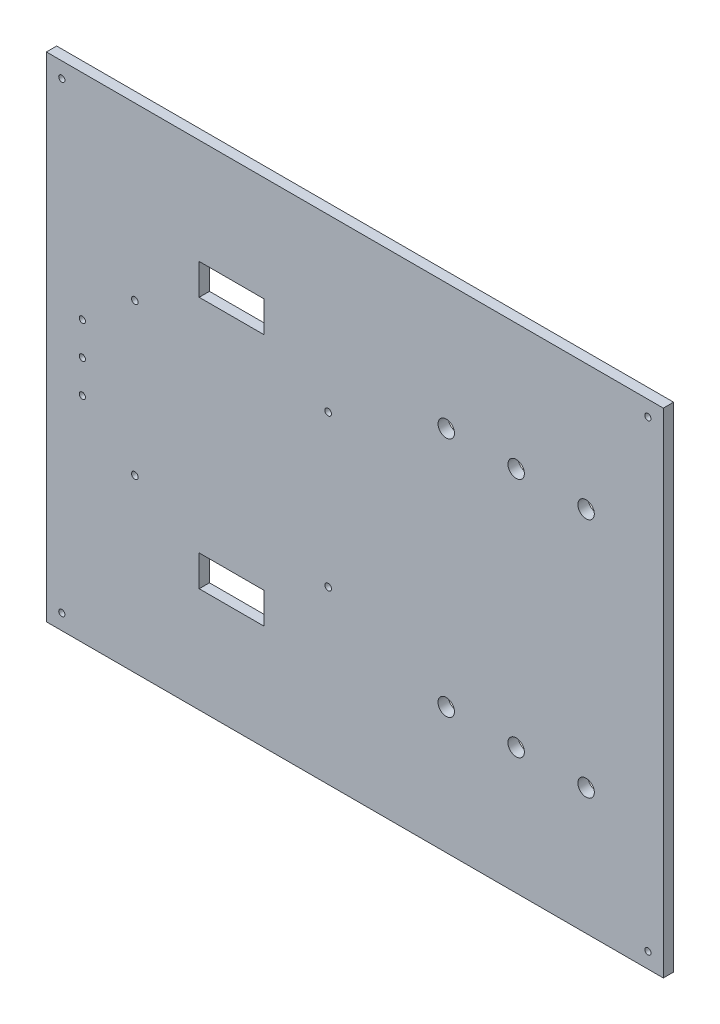
ISO-10303-21;
HEADER;
FILE_DESCRIPTION(('STEP AP214'),'2;1');
FILE_NAME('part.step','',(''),(''),'','','');
FILE_SCHEMA(('AUTOMOTIVE_DESIGN { 1 0 10303 214 1 1 1 1 }'));
ENDSEC;
DATA;
#1=APPLICATION_CONTEXT('core data for automotive mechanical design processes');
#2=APPLICATION_PROTOCOL_DEFINITION('international standard','automotive_design',2000,#1);
#3=PRODUCT_CONTEXT('',#1,'mechanical');
#4=PRODUCT('Part','Part','',(#3));
#5=PRODUCT_RELATED_PRODUCT_CATEGORY('part','',(#4));
#6=PRODUCT_DEFINITION_FORMATION('','',#4);
#7=PRODUCT_DEFINITION_CONTEXT('part definition',#1,'design');
#8=PRODUCT_DEFINITION('design','',#6,#7);
#9=PRODUCT_DEFINITION_SHAPE('','',#8);
#10=(LENGTH_UNIT() NAMED_UNIT(*) SI_UNIT(.MILLI.,.METRE.));
#11=(NAMED_UNIT(*) PLANE_ANGLE_UNIT() SI_UNIT($,.RADIAN.));
#12=(NAMED_UNIT(*) SI_UNIT($,.STERADIAN.) SOLID_ANGLE_UNIT());
#13=UNCERTAINTY_MEASURE_WITH_UNIT(LENGTH_MEASURE(1.E-05),#10,'distance_accuracy_value','');
#14=(GEOMETRIC_REPRESENTATION_CONTEXT(3) GLOBAL_UNCERTAINTY_ASSIGNED_CONTEXT((#13)) GLOBAL_UNIT_ASSIGNED_CONTEXT((#10,
#11,#12)) REPRESENTATION_CONTEXT('',''));
#15=CARTESIAN_POINT('',(0.,0.,0.));
#16=DIRECTION('',(0.,0.,1.));
#17=DIRECTION('',(1.,0.,0.));
#18=AXIS2_PLACEMENT_3D('',#15,#16,#17);
#19=CARTESIAN_POINT('',(0.,0.,5.));
#20=DIRECTION('',(0.,0.,-1.));
#21=DIRECTION('',(-1.,0.,0.));
#22=AXIS2_PLACEMENT_3D('',#19,#20,#21);
#23=PLANE('',#22);
#24=CARTESIAN_POINT('',(194.44243222447,61.3750001370397,5.));
#25=DIRECTION('',(0.,0.,1.));
#26=DIRECTION('',(1.,0.,0.));
#27=AXIS2_PLACEMENT_3D('',#24,#25,#26);
#28=CIRCLE('',#27,3.99999999999999);
#29=CARTESIAN_POINT('',(198.44243222447,61.3750001370397,5.));
#30=VERTEX_POINT('',#29);
#31=EDGE_CURVE('E406',#30,#30,#28,.T.);
#32=ORIENTED_EDGE('',*,*,#31,.F.);
#33=EDGE_LOOP('',(#32));
#34=FACE_BOUND('',#33,.T.);
#35=CARTESIAN_POINT('',(228.44243222447,61.3750001370398,5.));
#36=DIRECTION('',(0.,0.,1.));
#37=DIRECTION('',(1.,0.,0.));
#38=AXIS2_PLACEMENT_3D('',#35,#36,#37);
#39=CIRCLE('',#38,3.99999999999999);
#40=CARTESIAN_POINT('',(232.44243222447,61.3750001370398,5.));
#41=VERTEX_POINT('',#40);
#42=EDGE_CURVE('E407',#41,#41,#39,.T.);
#43=ORIENTED_EDGE('',*,*,#42,.F.);
#44=EDGE_LOOP('',(#43));
#45=FACE_BOUND('',#44,.T.);
#46=CARTESIAN_POINT('',(262.44243222447,61.3750001370398,5.));
#47=DIRECTION('',(0.,0.,1.));
#48=DIRECTION('',(1.,0.,0.));
#49=AXIS2_PLACEMENT_3D('',#46,#47,#48);
#50=CIRCLE('',#49,3.99999999999999);
#51=CARTESIAN_POINT('',(266.44243222447,61.3750001370398,5.));
#52=VERTEX_POINT('',#51);
#53=EDGE_CURVE('E417',#52,#52,#50,.T.);
#54=ORIENTED_EDGE('',*,*,#53,.F.);
#55=EDGE_LOOP('',(#54));
#56=FACE_BOUND('',#55,.T.);
#57=CARTESIAN_POINT('',(194.44243222447,178.62500013704,5.));
#58=DIRECTION('',(0.,0.,1.));
#59=DIRECTION('',(1.,0.,0.));
#60=AXIS2_PLACEMENT_3D('',#57,#58,#59);
#61=CIRCLE('',#60,3.99999999999999);
#62=CARTESIAN_POINT('',(198.44243222447,178.62500013704,5.));
#63=VERTEX_POINT('',#62);
#64=EDGE_CURVE('E427',#63,#63,#61,.T.);
#65=ORIENTED_EDGE('',*,*,#64,.F.);
#66=EDGE_LOOP('',(#65));
#67=FACE_BOUND('',#66,.T.);
#68=CARTESIAN_POINT('',(228.44243222447,178.62500013704,5.));
#69=DIRECTION('',(0.,0.,1.));
#70=DIRECTION('',(1.,0.,0.));
#71=AXIS2_PLACEMENT_3D('',#68,#69,#70);
#72=CIRCLE('',#71,3.99999999999999);
#73=CARTESIAN_POINT('',(232.44243222447,178.62500013704,5.));
#74=VERTEX_POINT('',#73);
#75=EDGE_CURVE('E430',#74,#74,#72,.T.);
#76=ORIENTED_EDGE('',*,*,#75,.F.);
#77=EDGE_LOOP('',(#76));
#78=FACE_BOUND('',#77,.T.);
#79=CARTESIAN_POINT('',(262.44243222447,178.62500013704,5.));
#80=DIRECTION('',(0.,0.,1.));
#81=DIRECTION('',(1.,0.,0.));
#82=AXIS2_PLACEMENT_3D('',#79,#80,#81);
#83=CIRCLE('',#82,3.99999999999999);
#84=CARTESIAN_POINT('',(266.44243222447,178.62500013704,5.));
#85=VERTEX_POINT('',#84);
#86=EDGE_CURVE('E436',#85,#85,#83,.T.);
#87=ORIENTED_EDGE('',*,*,#86,.F.);
#88=EDGE_LOOP('',(#87));
#89=FACE_BOUND('',#88,.T.);
#90=CARTESIAN_POINT('',(17.4847964856888,136.,5.));
#91=DIRECTION('',(0.,0.,-1.));
#92=DIRECTION('',(-1.,0.,0.));
#93=AXIS2_PLACEMENT_3D('',#90,#91,#92);
#94=CIRCLE('',#93,1.5);
#95=CARTESIAN_POINT('',(15.9847964856888,136.,5.));
#96=VERTEX_POINT('',#95);
#97=EDGE_CURVE('E445',#96,#96,#94,.T.);
#98=ORIENTED_EDGE('',*,*,#97,.T.);
#99=EDGE_LOOP('',(#98));
#100=FACE_BOUND('',#99,.T.);
#101=CARTESIAN_POINT('',(17.4847964856888,120.,5.));
#102=DIRECTION('',(0.,0.,-1.));
#103=DIRECTION('',(-1.,0.,0.));
#104=AXIS2_PLACEMENT_3D('',#101,#102,#103);
#105=CIRCLE('',#104,1.5);
#106=CARTESIAN_POINT('',(15.9847964856888,120.,5.));
#107=VERTEX_POINT('',#106);
#108=EDGE_CURVE('E448',#107,#107,#105,.T.);
#109=ORIENTED_EDGE('',*,*,#108,.T.);
#110=EDGE_LOOP('',(#109));
#111=FACE_BOUND('',#110,.T.);
#112=CARTESIAN_POINT('',(17.4847964856888,104.,5.));
#113=DIRECTION('',(0.,0.,-1.));
#114=DIRECTION('',(-1.,0.,0.));
#115=AXIS2_PLACEMENT_3D('',#112,#113,#114);
#116=CIRCLE('',#115,1.5);
#117=CARTESIAN_POINT('',(15.9847964856888,104.,5.));
#118=VERTEX_POINT('',#117);
#119=EDGE_CURVE('E454',#118,#118,#116,.T.);
#120=ORIENTED_EDGE('',*,*,#119,.T.);
#121=EDGE_LOOP('',(#120));
#122=FACE_BOUND('',#121,.T.);
#123=CARTESIAN_POINT('',(7.49999999999996,232.5,5.));
#124=DIRECTION('',(0.,0.,1.));
#125=DIRECTION('',(1.,0.,0.));
#126=AXIS2_PLACEMENT_3D('',#123,#124,#125);
#127=CIRCLE('',#126,1.5);
#128=CARTESIAN_POINT('',(8.99999999999996,232.5,5.));
#129=VERTEX_POINT('',#128);
#130=EDGE_CURVE('E170',#129,#129,#127,.T.);
#131=ORIENTED_EDGE('',*,*,#130,.F.);
#132=EDGE_LOOP('',(#131));
#133=FACE_BOUND('',#132,.T.);
#134=CARTESIAN_POINT('',(137.,83.17,5.));
#135=DIRECTION('',(0.,0.,1.));
#136=DIRECTION('',(1.,0.,0.));
#137=AXIS2_PLACEMENT_3D('',#134,#135,#136);
#138=CIRCLE('',#137,1.59999999999999);
#139=CARTESIAN_POINT('',(138.6,83.17,5.));
#140=VERTEX_POINT('',#139);
#141=EDGE_CURVE('E176',#140,#140,#138,.T.);
#142=ORIENTED_EDGE('',*,*,#141,.F.);
#143=EDGE_LOOP('',(#142));
#144=FACE_BOUND('',#143,.T.);
#145=CARTESIAN_POINT('',(43.,83.17,5.));
#146=DIRECTION('',(0.,0.,1.));
#147=DIRECTION('',(-1.,0.,0.));
#148=AXIS2_PLACEMENT_3D('',#145,#146,#147);
#149=CIRCLE('',#148,1.6);
#150=CARTESIAN_POINT('',(41.4,83.17,5.));
#151=VERTEX_POINT('',#150);
#152=EDGE_CURVE('E182',#151,#151,#149,.T.);
#153=ORIENTED_EDGE('',*,*,#152,.F.);
#154=EDGE_LOOP('',(#153));
#155=FACE_BOUND('',#154,.T.);
#156=CARTESIAN_POINT('',(43.,156.83,5.));
#157=DIRECTION('',(0.,0.,1.));
#158=DIRECTION('',(1.,0.,0.));
#159=AXIS2_PLACEMENT_3D('',#156,#157,#158);
#160=CIRCLE('',#159,1.6);
#161=CARTESIAN_POINT('',(44.6,156.83,5.));
#162=VERTEX_POINT('',#161);
#163=EDGE_CURVE('E188',#162,#162,#160,.T.);
#164=ORIENTED_EDGE('',*,*,#163,.F.);
#165=EDGE_LOOP('',(#164));
#166=FACE_BOUND('',#165,.T.);
#167=DIRECTION('',(1.,0.,0.));
#168=VECTOR('',#167,1.);
#169=CARTESIAN_POINT('',(105.7,173.83,5.));
#170=LINE('',#169,#168);
#171=CARTESIAN_POINT('',(74.3,173.83,5.));
#172=VERTEX_POINT('',#171);
#173=CARTESIAN_POINT('',(105.7,173.83,5.));
#174=VERTEX_POINT('',#173);
#175=EDGE_CURVE('E194',#172,#174,#170,.T.);
#176=ORIENTED_EDGE('',*,*,#175,.F.);
#177=DIRECTION('',(0.,-1.,0.));
#178=VECTOR('',#177,1.);
#179=CARTESIAN_POINT('',(74.3,173.83,5.));
#180=LINE('',#179,#178);
#181=CARTESIAN_POINT('',(74.3,188.92,5.));
#182=VERTEX_POINT('',#181);
#183=EDGE_CURVE('E202',#182,#172,#180,.T.);
#184=ORIENTED_EDGE('',*,*,#183,.F.);
#185=DIRECTION('',(-1.,0.,0.));
#186=VECTOR('',#185,1.);
#187=CARTESIAN_POINT('',(105.7,188.92,5.));
#188=LINE('',#187,#186);
#189=CARTESIAN_POINT('',(105.7,188.92,5.));
#190=VERTEX_POINT('',#189);
#191=EDGE_CURVE('E199',#190,#182,#188,.T.);
#192=ORIENTED_EDGE('',*,*,#191,.F.);
#193=DIRECTION('',(0.,1.,0.));
#194=VECTOR('',#193,1.);
#195=CARTESIAN_POINT('',(105.7,173.83,5.));
#196=LINE('',#195,#194);
#197=EDGE_CURVE('E196',#174,#190,#196,.T.);
#198=ORIENTED_EDGE('',*,*,#197,.F.);
#199=EDGE_LOOP('',(#176,#184,#192,#198));
#200=FACE_BOUND('',#199,.T.);
#201=DIRECTION('',(0.,-1.,0.));
#202=VECTOR('',#201,1.);
#203=CARTESIAN_POINT('',(0.,0.,5.));
#204=LINE('',#203,#202);
#205=CARTESIAN_POINT('',(0.,240.,5.));
#206=VERTEX_POINT('',#205);
#207=CARTESIAN_POINT('',(0.,0.,5.));
#208=VERTEX_POINT('',#207);
#209=EDGE_CURVE('E231',#206,#208,#204,.T.);
#210=ORIENTED_EDGE('',*,*,#209,.T.);
#211=DIRECTION('',(1.,0.,0.));
#212=VECTOR('',#211,1.);
#213=CARTESIAN_POINT('',(0.,0.,5.));
#214=LINE('',#213,#212);
#215=CARTESIAN_POINT('',(300.,0.,5.));
#216=VERTEX_POINT('',#215);
#217=EDGE_CURVE('E234',#208,#216,#214,.T.);
#218=ORIENTED_EDGE('',*,*,#217,.T.);
#219=DIRECTION('',(0.,1.,0.));
#220=VECTOR('',#219,1.);
#221=CARTESIAN_POINT('',(300.,0.,5.));
#222=LINE('',#221,#220);
#223=CARTESIAN_POINT('',(300.,240.,5.));
#224=VERTEX_POINT('',#223);
#225=EDGE_CURVE('E237',#216,#224,#222,.T.);
#226=ORIENTED_EDGE('',*,*,#225,.T.);
#227=DIRECTION('',(-1.,0.,0.));
#228=VECTOR('',#227,1.);
#229=CARTESIAN_POINT('',(0.,240.,5.));
#230=LINE('',#229,#228);
#231=EDGE_CURVE('E239',#224,#206,#230,.T.);
#232=ORIENTED_EDGE('',*,*,#231,.T.);
#233=EDGE_LOOP('',(#210,#218,#226,#232));
#234=FACE_BOUND('',#233,.T.);
#235=CARTESIAN_POINT('',(137.,156.83,5.));
#236=DIRECTION('',(0.,0.,1.));
#237=DIRECTION('',(-1.,0.,0.));
#238=AXIS2_PLACEMENT_3D('',#235,#236,#237);
#239=CIRCLE('',#238,1.59999999999999);
#240=CARTESIAN_POINT('',(135.4,156.83,5.));
#241=VERTEX_POINT('',#240);
#242=EDGE_CURVE('E225',#241,#241,#239,.T.);
#243=ORIENTED_EDGE('',*,*,#242,.F.);
#244=EDGE_LOOP('',(#243));
#245=FACE_BOUND('',#244,.T.);
#246=DIRECTION('',(0.,1.,0.));
#247=VECTOR('',#246,1.);
#248=CARTESIAN_POINT('',(105.7,66.17,5.));
#249=LINE('',#248,#247);
#250=CARTESIAN_POINT('',(105.7,51.08,5.));
#251=VERTEX_POINT('',#250);
#252=CARTESIAN_POINT('',(105.7,66.17,5.));
#253=VERTEX_POINT('',#252);
#254=EDGE_CURVE('E131',#251,#253,#249,.T.);
#255=ORIENTED_EDGE('',*,*,#254,.F.);
#256=DIRECTION('',(1.,0.,0.));
#257=VECTOR('',#256,1.);
#258=CARTESIAN_POINT('',(105.7,51.08,5.));
#259=LINE('',#258,#257);
#260=CARTESIAN_POINT('',(74.3,51.08,5.));
#261=VERTEX_POINT('',#260);
#262=EDGE_CURVE('E154',#261,#251,#259,.T.);
#263=ORIENTED_EDGE('',*,*,#262,.F.);
#264=DIRECTION('',(0.,-1.,0.));
#265=VECTOR('',#264,1.);
#266=CARTESIAN_POINT('',(74.3,66.17,5.));
#267=LINE('',#266,#265);
#268=CARTESIAN_POINT('',(74.3,66.17,5.));
#269=VERTEX_POINT('',#268);
#270=EDGE_CURVE('E152',#269,#261,#267,.T.);
#271=ORIENTED_EDGE('',*,*,#270,.F.);
#272=DIRECTION('',(-1.,0.,0.));
#273=VECTOR('',#272,1.);
#274=CARTESIAN_POINT('',(105.7,66.17,5.));
#275=LINE('',#274,#273);
#276=EDGE_CURVE('E139',#253,#269,#275,.T.);
#277=ORIENTED_EDGE('',*,*,#276,.F.);
#278=EDGE_LOOP('',(#255,#263,#271,#277));
#279=FACE_BOUND('',#278,.T.);
#280=CARTESIAN_POINT('',(292.5,232.5,5.));
#281=DIRECTION('',(0.,0.,1.));
#282=DIRECTION('',(-1.,0.,0.));
#283=AXIS2_PLACEMENT_3D('',#280,#281,#282);
#284=CIRCLE('',#283,1.50000000000002);
#285=CARTESIAN_POINT('',(291.,232.5,5.));
#286=VERTEX_POINT('',#285);
#287=EDGE_CURVE('E160',#286,#286,#284,.T.);
#288=ORIENTED_EDGE('',*,*,#287,.F.);
#289=EDGE_LOOP('',(#288));
#290=FACE_BOUND('',#289,.T.);
#291=CARTESIAN_POINT('',(292.5,7.49999999999998,5.));
#292=DIRECTION('',(0.,0.,1.));
#293=DIRECTION('',(1.,0.,0.));
#294=AXIS2_PLACEMENT_3D('',#291,#292,#293);
#295=CIRCLE('',#294,1.50000000000002);
#296=CARTESIAN_POINT('',(294.,7.49999999999998,5.));
#297=VERTEX_POINT('',#296);
#298=EDGE_CURVE('E465',#297,#297,#295,.T.);
#299=ORIENTED_EDGE('',*,*,#298,.F.);
#300=EDGE_LOOP('',(#299));
#301=FACE_BOUND('',#300,.T.);
#302=CARTESIAN_POINT('',(7.49999999999996,7.49999999999998,5.));
#303=DIRECTION('',(0.,0.,1.));
#304=DIRECTION('',(-1.,0.,0.));
#305=AXIS2_PLACEMENT_3D('',#302,#303,#304);
#306=CIRCLE('',#305,1.5);
#307=CARTESIAN_POINT('',(5.99999999999996,7.49999999999998,5.));
#308=VERTEX_POINT('',#307);
#309=EDGE_CURVE('E459',#308,#308,#306,.T.);
#310=ORIENTED_EDGE('',*,*,#309,.F.);
#311=EDGE_LOOP('',(#310));
#312=FACE_BOUND('',#311,.T.);
#313=ADVANCED_FACE('F42',(#34,#45,#56,#67,#78,#89,#100,#111,#122,#133,#144,#155,#166,#200,#234,
#245,#279,#290,#301,#312),#23,.F.);
#314=CARTESIAN_POINT('',(0.,0.,0.));
#315=DIRECTION('',(0.,0.,-1.));
#316=DIRECTION('',(-1.,0.,0.));
#317=AXIS2_PLACEMENT_3D('',#314,#315,#316);
#318=PLANE('',#317);
#319=CARTESIAN_POINT('',(194.44243222447,61.3750001370397,0.));
#320=DIRECTION('',(0.,0.,1.));
#321=DIRECTION('',(1.,0.,0.));
#322=AXIS2_PLACEMENT_3D('',#319,#320,#321);
#323=CIRCLE('',#322,3.99999999999999);
#324=CARTESIAN_POINT('',(198.44243222447,61.3750001370397,0.));
#325=VERTEX_POINT('',#324);
#326=EDGE_CURVE('E404',#325,#325,#323,.T.);
#327=ORIENTED_EDGE('',*,*,#326,.T.);
#328=EDGE_LOOP('',(#327));
#329=FACE_BOUND('',#328,.T.);
#330=CARTESIAN_POINT('',(228.44243222447,61.3750001370398,0.));
#331=DIRECTION('',(0.,0.,1.));
#332=DIRECTION('',(1.,0.,0.));
#333=AXIS2_PLACEMENT_3D('',#330,#331,#332);
#334=CIRCLE('',#333,3.99999999999999);
#335=CARTESIAN_POINT('',(232.44243222447,61.3750001370398,0.));
#336=VERTEX_POINT('',#335);
#337=EDGE_CURVE('E412',#336,#336,#334,.T.);
#338=ORIENTED_EDGE('',*,*,#337,.T.);
#339=EDGE_LOOP('',(#338));
#340=FACE_BOUND('',#339,.T.);
#341=CARTESIAN_POINT('',(262.44243222447,61.3750001370398,0.));
#342=DIRECTION('',(0.,0.,1.));
#343=DIRECTION('',(1.,0.,0.));
#344=AXIS2_PLACEMENT_3D('',#341,#342,#343);
#345=CIRCLE('',#344,3.99999999999999);
#346=CARTESIAN_POINT('',(266.44243222447,61.3750001370398,0.));
#347=VERTEX_POINT('',#346);
#348=EDGE_CURVE('E420',#347,#347,#345,.T.);
#349=ORIENTED_EDGE('',*,*,#348,.T.);
#350=EDGE_LOOP('',(#349));
#351=FACE_BOUND('',#350,.T.);
#352=CARTESIAN_POINT('',(194.44243222447,178.62500013704,0.));
#353=DIRECTION('',(0.,0.,1.));
#354=DIRECTION('',(1.,0.,0.));
#355=AXIS2_PLACEMENT_3D('',#352,#353,#354);
#356=CIRCLE('',#355,3.99999999999999);
#357=CARTESIAN_POINT('',(198.44243222447,178.62500013704,0.));
#358=VERTEX_POINT('',#357);
#359=EDGE_CURVE('E423',#358,#358,#356,.T.);
#360=ORIENTED_EDGE('',*,*,#359,.T.);
#361=EDGE_LOOP('',(#360));
#362=FACE_BOUND('',#361,.T.);
#363=CARTESIAN_POINT('',(228.44243222447,178.62500013704,0.));
#364=DIRECTION('',(0.,0.,1.));
#365=DIRECTION('',(1.,0.,0.));
#366=AXIS2_PLACEMENT_3D('',#363,#364,#365);
#367=CIRCLE('',#366,3.99999999999999);
#368=CARTESIAN_POINT('',(232.44243222447,178.62500013704,0.));
#369=VERTEX_POINT('',#368);
#370=EDGE_CURVE('E433',#369,#369,#367,.T.);
#371=ORIENTED_EDGE('',*,*,#370,.T.);
#372=EDGE_LOOP('',(#371));
#373=FACE_BOUND('',#372,.T.);
#374=CARTESIAN_POINT('',(262.44243222447,178.62500013704,0.));
#375=DIRECTION('',(0.,0.,1.));
#376=DIRECTION('',(1.,0.,0.));
#377=AXIS2_PLACEMENT_3D('',#374,#375,#376);
#378=CIRCLE('',#377,3.99999999999999);
#379=CARTESIAN_POINT('',(266.44243222447,178.62500013704,0.));
#380=VERTEX_POINT('',#379);
#381=EDGE_CURVE('E409',#380,#380,#378,.T.);
#382=ORIENTED_EDGE('',*,*,#381,.T.);
#383=EDGE_LOOP('',(#382));
#384=FACE_BOUND('',#383,.T.);
#385=CARTESIAN_POINT('',(17.4847964856888,136.,0.));
#386=DIRECTION('',(0.,0.,-1.));
#387=DIRECTION('',(-1.,0.,0.));
#388=AXIS2_PLACEMENT_3D('',#385,#386,#387);
#389=CIRCLE('',#388,1.5);
#390=CARTESIAN_POINT('',(15.9847964856888,136.,0.));
#391=VERTEX_POINT('',#390);
#392=EDGE_CURVE('E441',#391,#391,#389,.T.);
#393=ORIENTED_EDGE('',*,*,#392,.F.);
#394=EDGE_LOOP('',(#393));
#395=FACE_BOUND('',#394,.T.);
#396=CARTESIAN_POINT('',(17.4847964856888,120.,0.));
#397=DIRECTION('',(0.,0.,-1.));
#398=DIRECTION('',(-1.,0.,0.));
#399=AXIS2_PLACEMENT_3D('',#396,#397,#398);
#400=CIRCLE('',#399,1.5);
#401=CARTESIAN_POINT('',(15.9847964856888,120.,0.));
#402=VERTEX_POINT('',#401);
#403=EDGE_CURVE('E451',#402,#402,#400,.T.);
#404=ORIENTED_EDGE('',*,*,#403,.F.);
#405=EDGE_LOOP('',(#404));
#406=FACE_BOUND('',#405,.T.);
#407=CARTESIAN_POINT('',(17.4847964856888,104.,0.));
#408=DIRECTION('',(0.,0.,-1.));
#409=DIRECTION('',(-1.,0.,0.));
#410=AXIS2_PLACEMENT_3D('',#407,#408,#409);
#411=CIRCLE('',#410,1.5);
#412=CARTESIAN_POINT('',(15.9847964856888,104.,0.));
#413=VERTEX_POINT('',#412);
#414=EDGE_CURVE('E426',#413,#413,#411,.T.);
#415=ORIENTED_EDGE('',*,*,#414,.F.);
#416=EDGE_LOOP('',(#415));
#417=FACE_BOUND('',#416,.T.);
#418=CARTESIAN_POINT('',(292.5,7.49999999999998,0.));
#419=DIRECTION('',(0.,0.,1.));
#420=DIRECTION('',(1.,0.,0.));
#421=AXIS2_PLACEMENT_3D('',#418,#419,#420);
#422=CIRCLE('',#421,1.50000000000002);
#423=CARTESIAN_POINT('',(294.,7.49999999999998,0.));
#424=VERTEX_POINT('',#423);
#425=EDGE_CURVE('E462',#424,#424,#422,.T.);
#426=ORIENTED_EDGE('',*,*,#425,.T.);
#427=EDGE_LOOP('',(#426));
#428=FACE_BOUND('',#427,.T.);
#429=DIRECTION('',(1.,0.,0.));
#430=VECTOR('',#429,1.);
#431=CARTESIAN_POINT('',(105.7,51.08,0.));
#432=LINE('',#431,#430);
#433=CARTESIAN_POINT('',(74.3,51.08,0.));
#434=VERTEX_POINT('',#433);
#435=CARTESIAN_POINT('',(105.7,51.08,0.));
#436=VERTEX_POINT('',#435);
#437=EDGE_CURVE('E140',#434,#436,#432,.T.);
#438=ORIENTED_EDGE('',*,*,#437,.T.);
#439=DIRECTION('',(0.,1.,0.));
#440=VECTOR('',#439,1.);
#441=CARTESIAN_POINT('',(105.7,66.17,0.));
#442=LINE('',#441,#440);
#443=CARTESIAN_POINT('',(105.7,66.17,0.));
#444=VERTEX_POINT('',#443);
#445=EDGE_CURVE('E65',#436,#444,#442,.T.);
#446=ORIENTED_EDGE('',*,*,#445,.T.);
#447=DIRECTION('',(-1.,0.,0.));
#448=VECTOR('',#447,1.);
#449=CARTESIAN_POINT('',(105.7,66.17,0.));
#450=LINE('',#449,#448);
#451=CARTESIAN_POINT('',(74.3,66.17,0.));
#452=VERTEX_POINT('',#451);
#453=EDGE_CURVE('E146',#444,#452,#450,.T.);
#454=ORIENTED_EDGE('',*,*,#453,.T.);
#455=DIRECTION('',(0.,-1.,0.));
#456=VECTOR('',#455,1.);
#457=CARTESIAN_POINT('',(74.3,66.17,0.));
#458=LINE('',#457,#456);
#459=EDGE_CURVE('E162',#452,#434,#458,.T.);
#460=ORIENTED_EDGE('',*,*,#459,.T.);
#461=EDGE_LOOP('',(#438,#446,#454,#460));
#462=FACE_BOUND('',#461,.T.);
#463=CARTESIAN_POINT('',(7.49999999999996,232.5,0.));
#464=DIRECTION('',(0.,0.,1.));
#465=DIRECTION('',(1.,0.,0.));
#466=AXIS2_PLACEMENT_3D('',#463,#464,#465);
#467=CIRCLE('',#466,1.5);
#468=CARTESIAN_POINT('',(8.99999999999996,232.5,0.));
#469=VERTEX_POINT('',#468);
#470=EDGE_CURVE('E147',#469,#469,#467,.T.);
#471=ORIENTED_EDGE('',*,*,#470,.T.);
#472=EDGE_LOOP('',(#471));
#473=FACE_BOUND('',#472,.T.);
#474=CARTESIAN_POINT('',(43.,83.17,0.));
#475=DIRECTION('',(0.,0.,1.));
#476=DIRECTION('',(-1.,0.,0.));
#477=AXIS2_PLACEMENT_3D('',#474,#475,#476);
#478=CIRCLE('',#477,1.6);
#479=CARTESIAN_POINT('',(41.4,83.17,0.));
#480=VERTEX_POINT('',#479);
#481=EDGE_CURVE('E179',#480,#480,#478,.T.);
#482=ORIENTED_EDGE('',*,*,#481,.T.);
#483=EDGE_LOOP('',(#482));
#484=FACE_BOUND('',#483,.T.);
#485=DIRECTION('',(0.,-1.,0.));
#486=VECTOR('',#485,1.);
#487=CARTESIAN_POINT('',(74.3,173.83,0.));
#488=LINE('',#487,#486);
#489=CARTESIAN_POINT('',(74.3,188.92,0.));
#490=VERTEX_POINT('',#489);
#491=CARTESIAN_POINT('',(74.3,173.83,0.));
#492=VERTEX_POINT('',#491);
#493=EDGE_CURVE('E197',#490,#492,#488,.T.);
#494=ORIENTED_EDGE('',*,*,#493,.T.);
#495=DIRECTION('',(1.,0.,0.));
#496=VECTOR('',#495,1.);
#497=CARTESIAN_POINT('',(105.7,173.83,0.));
#498=LINE('',#497,#496);
#499=CARTESIAN_POINT('',(105.7,173.83,0.));
#500=VERTEX_POINT('',#499);
#501=EDGE_CURVE('E191',#492,#500,#498,.T.);
#502=ORIENTED_EDGE('',*,*,#501,.T.);
#503=DIRECTION('',(0.,1.,0.));
#504=VECTOR('',#503,1.);
#505=CARTESIAN_POINT('',(105.7,173.83,0.));
#506=LINE('',#505,#504);
#507=CARTESIAN_POINT('',(105.7,188.92,0.));
#508=VERTEX_POINT('',#507);
#509=EDGE_CURVE('E207',#500,#508,#506,.T.);
#510=ORIENTED_EDGE('',*,*,#509,.T.);
#511=DIRECTION('',(-1.,0.,0.));
#512=VECTOR('',#511,1.);
#513=CARTESIAN_POINT('',(105.7,188.92,0.));
#514=LINE('',#513,#512);
#515=EDGE_CURVE('E210',#508,#490,#514,.T.);
#516=ORIENTED_EDGE('',*,*,#515,.T.);
#517=EDGE_LOOP('',(#494,#502,#510,#516));
#518=FACE_BOUND('',#517,.T.);
#519=CARTESIAN_POINT('',(137.,156.83,0.));
#520=DIRECTION('',(0.,0.,1.));
#521=DIRECTION('',(-1.,0.,0.));
#522=AXIS2_PLACEMENT_3D('',#519,#520,#521);
#523=CIRCLE('',#522,1.59999999999999);
#524=CARTESIAN_POINT('',(135.4,156.83,0.));
#525=VERTEX_POINT('',#524);
#526=EDGE_CURVE('E224',#525,#525,#523,.T.);
#527=ORIENTED_EDGE('',*,*,#526,.T.);
#528=EDGE_LOOP('',(#527));
#529=FACE_BOUND('',#528,.T.);
#530=DIRECTION('',(0.,-1.,0.));
#531=VECTOR('',#530,1.);
#532=CARTESIAN_POINT('',(0.,0.,0.));
#533=LINE('',#532,#531);
#534=CARTESIAN_POINT('',(0.,240.,0.));
#535=VERTEX_POINT('',#534);
#536=CARTESIAN_POINT('',(0.,0.,0.));
#537=VERTEX_POINT('',#536);
#538=EDGE_CURVE('E228',#535,#537,#533,.T.);
#539=ORIENTED_EDGE('',*,*,#538,.F.);
#540=DIRECTION('',(-1.,0.,0.));
#541=VECTOR('',#540,1.);
#542=CARTESIAN_POINT('',(0.,240.,0.));
#543=LINE('',#542,#541);
#544=CARTESIAN_POINT('',(300.,240.,0.));
#545=VERTEX_POINT('',#544);
#546=EDGE_CURVE('E235',#545,#535,#543,.T.);
#547=ORIENTED_EDGE('',*,*,#546,.F.);
#548=DIRECTION('',(0.,1.,0.));
#549=VECTOR('',#548,1.);
#550=CARTESIAN_POINT('',(300.,0.,0.));
#551=LINE('',#550,#549);
#552=CARTESIAN_POINT('',(300.,0.,0.));
#553=VERTEX_POINT('',#552);
#554=EDGE_CURVE('E246',#553,#545,#551,.T.);
#555=ORIENTED_EDGE('',*,*,#554,.F.);
#556=DIRECTION('',(1.,0.,0.));
#557=VECTOR('',#556,1.);
#558=CARTESIAN_POINT('',(0.,0.,0.));
#559=LINE('',#558,#557);
#560=EDGE_CURVE('E244',#537,#553,#559,.T.);
#561=ORIENTED_EDGE('',*,*,#560,.F.);
#562=EDGE_LOOP('',(#539,#547,#555,#561));
#563=FACE_BOUND('',#562,.T.);
#564=CARTESIAN_POINT('',(43.,156.83,0.));
#565=DIRECTION('',(0.,0.,1.));
#566=DIRECTION('',(1.,0.,0.));
#567=AXIS2_PLACEMENT_3D('',#564,#565,#566);
#568=CIRCLE('',#567,1.6);
#569=CARTESIAN_POINT('',(44.6,156.83,0.));
#570=VERTEX_POINT('',#569);
#571=EDGE_CURVE('E185',#570,#570,#568,.T.);
#572=ORIENTED_EDGE('',*,*,#571,.T.);
#573=EDGE_LOOP('',(#572));
#574=FACE_BOUND('',#573,.T.);
#575=CARTESIAN_POINT('',(137.,83.17,0.));
#576=DIRECTION('',(0.,0.,1.));
#577=DIRECTION('',(1.,0.,0.));
#578=AXIS2_PLACEMENT_3D('',#575,#576,#577);
#579=CIRCLE('',#578,1.59999999999999);
#580=CARTESIAN_POINT('',(138.6,83.17,0.));
#581=VERTEX_POINT('',#580);
#582=EDGE_CURVE('E173',#581,#581,#579,.T.);
#583=ORIENTED_EDGE('',*,*,#582,.T.);
#584=EDGE_LOOP('',(#583));
#585=FACE_BOUND('',#584,.T.);
#586=CARTESIAN_POINT('',(292.5,232.5,0.));
#587=DIRECTION('',(0.,0.,1.));
#588=DIRECTION('',(-1.,0.,0.));
#589=AXIS2_PLACEMENT_3D('',#586,#587,#588);
#590=CIRCLE('',#589,1.50000000000002);
#591=CARTESIAN_POINT('',(291.,232.5,0.));
#592=VERTEX_POINT('',#591);
#593=EDGE_CURVE('E468',#592,#592,#590,.T.);
#594=ORIENTED_EDGE('',*,*,#593,.T.);
#595=EDGE_LOOP('',(#594));
#596=FACE_BOUND('',#595,.T.);
#597=CARTESIAN_POINT('',(7.49999999999996,7.49999999999998,0.));
#598=DIRECTION('',(0.,0.,1.));
#599=DIRECTION('',(-1.,0.,0.));
#600=AXIS2_PLACEMENT_3D('',#597,#598,#599);
#601=CIRCLE('',#600,1.5);
#602=CARTESIAN_POINT('',(5.99999999999996,7.49999999999998,0.));
#603=VERTEX_POINT('',#602);
#604=EDGE_CURVE('E444',#603,#603,#601,.T.);
#605=ORIENTED_EDGE('',*,*,#604,.T.);
#606=EDGE_LOOP('',(#605));
#607=FACE_BOUND('',#606,.T.);
#608=ADVANCED_FACE('F264',(#329,#340,#351,#362,#373,#384,#395,#406,#417,#428,#462,#473,#484,
#518,#529,#563,#574,#585,#596,#607),#318,.T.);
#609=CARTESIAN_POINT('',(0.,0.,5.));
#610=DIRECTION('',(1.,0.,0.));
#611=DIRECTION('',(0.,0.,-1.));
#612=AXIS2_PLACEMENT_3D('',#609,#610,#611);
#613=PLANE('',#612);
#614=ORIENTED_EDGE('',*,*,#538,.T.);
#615=DIRECTION('',(0.,0.,-1.));
#616=VECTOR('',#615,1.);
#617=CARTESIAN_POINT('',(0.,0.,5.));
#618=LINE('',#617,#616);
#619=EDGE_CURVE('E11',#208,#537,#618,.T.);
#620=ORIENTED_EDGE('',*,*,#619,.F.);
#621=ORIENTED_EDGE('',*,*,#209,.F.);
#622=DIRECTION('',(0.,0.,-1.));
#623=VECTOR('',#622,1.);
#624=CARTESIAN_POINT('',(0.,240.,5.));
#625=LINE('',#624,#623);
#626=EDGE_CURVE('E241',#206,#535,#625,.T.);
#627=ORIENTED_EDGE('',*,*,#626,.T.);
#628=EDGE_LOOP('',(#614,#620,#621,#627));
#629=FACE_BOUND('',#628,.T.);
#630=ADVANCED_FACE('F44',(#629),#613,.F.);
#631=CARTESIAN_POINT('',(0.,0.,5.));
#632=DIRECTION('',(0.,1.,0.));
#633=DIRECTION('',(0.,0.,1.));
#634=AXIS2_PLACEMENT_3D('',#631,#632,#633);
#635=PLANE('',#634);
#636=ORIENTED_EDGE('',*,*,#560,.T.);
#637=DIRECTION('',(0.,0.,-1.));
#638=VECTOR('',#637,1.);
#639=CARTESIAN_POINT('',(300.,0.,5.));
#640=LINE('',#639,#638);
#641=EDGE_CURVE('E50',#216,#553,#640,.T.);
#642=ORIENTED_EDGE('',*,*,#641,.F.);
#643=ORIENTED_EDGE('',*,*,#217,.F.);
#644=ORIENTED_EDGE('',*,*,#619,.T.);
#645=EDGE_LOOP('',(#636,#642,#643,#644));
#646=FACE_BOUND('',#645,.T.);
#647=ADVANCED_FACE('F275',(#646),#635,.F.);
#648=CARTESIAN_POINT('',(300.,0.,5.));
#649=DIRECTION('',(-1.,0.,0.));
#650=DIRECTION('',(0.,0.,1.));
#651=AXIS2_PLACEMENT_3D('',#648,#649,#650);
#652=PLANE('',#651);
#653=ORIENTED_EDGE('',*,*,#554,.T.);
#654=DIRECTION('',(0.,0.,-1.));
#655=VECTOR('',#654,1.);
#656=CARTESIAN_POINT('',(300.,240.,5.));
#657=LINE('',#656,#655);
#658=EDGE_CURVE('E251',#224,#545,#657,.T.);
#659=ORIENTED_EDGE('',*,*,#658,.F.);
#660=ORIENTED_EDGE('',*,*,#225,.F.);
#661=ORIENTED_EDGE('',*,*,#641,.T.);
#662=EDGE_LOOP('',(#653,#659,#660,#661));
#663=FACE_BOUND('',#662,.T.);
#664=ADVANCED_FACE('F258',(#663),#652,.F.);
#665=CARTESIAN_POINT('',(0.,240.,5.));
#666=DIRECTION('',(0.,-1.,0.));
#667=DIRECTION('',(0.,0.,-1.));
#668=AXIS2_PLACEMENT_3D('',#665,#666,#667);
#669=PLANE('',#668);
#670=ORIENTED_EDGE('',*,*,#546,.T.);
#671=ORIENTED_EDGE('',*,*,#626,.F.);
#672=ORIENTED_EDGE('',*,*,#231,.F.);
#673=ORIENTED_EDGE('',*,*,#658,.T.);
#674=EDGE_LOOP('',(#670,#671,#672,#673));
#675=FACE_BOUND('',#674,.T.);
#676=ADVANCED_FACE('F268',(#675),#669,.F.);
#677=CARTESIAN_POINT('',(137.,156.83,5.));
#678=DIRECTION('',(0.,0.,-1.));
#679=DIRECTION('',(-1.,0.,0.));
#680=AXIS2_PLACEMENT_3D('',#677,#678,#679);
#681=CYLINDRICAL_SURFACE('',#680,1.59999999999999);
#682=ORIENTED_EDGE('',*,*,#242,.T.);
#683=EDGE_LOOP('',(#682));
#684=FACE_BOUND('',#683,.T.);
#685=ORIENTED_EDGE('',*,*,#526,.F.);
#686=EDGE_LOOP('',(#685));
#687=FACE_BOUND('',#686,.T.);
#688=ADVANCED_FACE('F293',(#684,#687),#681,.F.);
#689=CARTESIAN_POINT('',(105.7,173.83,5.));
#690=DIRECTION('',(0.,1.,0.));
#691=DIRECTION('',(0.,0.,1.));
#692=AXIS2_PLACEMENT_3D('',#689,#690,#691);
#693=PLANE('',#692);
#694=ORIENTED_EDGE('',*,*,#501,.F.);
#695=DIRECTION('',(0.,0.,-1.));
#696=VECTOR('',#695,1.);
#697=CARTESIAN_POINT('',(74.3,173.83,5.));
#698=LINE('',#697,#696);
#699=EDGE_CURVE('E204',#172,#492,#698,.T.);
#700=ORIENTED_EDGE('',*,*,#699,.F.);
#701=ORIENTED_EDGE('',*,*,#175,.T.);
#702=DIRECTION('',(0.,0.,-1.));
#703=VECTOR('',#702,1.);
#704=CARTESIAN_POINT('',(105.7,173.83,5.));
#705=LINE('',#704,#703);
#706=EDGE_CURVE('E221',#174,#500,#705,.T.);
#707=ORIENTED_EDGE('',*,*,#706,.T.);
#708=EDGE_LOOP('',(#694,#700,#701,#707));
#709=FACE_BOUND('',#708,.T.);
#710=ADVANCED_FACE('F300',(#709),#693,.T.);
#711=CARTESIAN_POINT('',(105.7,173.83,5.));
#712=DIRECTION('',(-1.,0.,0.));
#713=DIRECTION('',(0.,0.,1.));
#714=AXIS2_PLACEMENT_3D('',#711,#712,#713);
#715=PLANE('',#714);
#716=ORIENTED_EDGE('',*,*,#509,.F.);
#717=ORIENTED_EDGE('',*,*,#706,.F.);
#718=ORIENTED_EDGE('',*,*,#197,.T.);
#719=DIRECTION('',(0.,0.,-1.));
#720=VECTOR('',#719,1.);
#721=CARTESIAN_POINT('',(105.7,188.92,5.));
#722=LINE('',#721,#720);
#723=EDGE_CURVE('E219',#190,#508,#722,.T.);
#724=ORIENTED_EDGE('',*,*,#723,.T.);
#725=EDGE_LOOP('',(#716,#717,#718,#724));
#726=FACE_BOUND('',#725,.T.);
#727=ADVANCED_FACE('F305',(#726),#715,.T.);
#728=CARTESIAN_POINT('',(105.7,188.92,5.));
#729=DIRECTION('',(0.,-1.,0.));
#730=DIRECTION('',(0.,0.,-1.));
#731=AXIS2_PLACEMENT_3D('',#728,#729,#730);
#732=PLANE('',#731);
#733=ORIENTED_EDGE('',*,*,#515,.F.);
#734=ORIENTED_EDGE('',*,*,#723,.F.);
#735=ORIENTED_EDGE('',*,*,#191,.T.);
#736=DIRECTION('',(0.,0.,-1.));
#737=VECTOR('',#736,1.);
#738=CARTESIAN_POINT('',(74.3,188.92,5.));
#739=LINE('',#738,#737);
#740=EDGE_CURVE('E217',#182,#490,#739,.T.);
#741=ORIENTED_EDGE('',*,*,#740,.T.);
#742=EDGE_LOOP('',(#733,#734,#735,#741));
#743=FACE_BOUND('',#742,.T.);
#744=ADVANCED_FACE('F314',(#743),#732,.T.);
#745=CARTESIAN_POINT('',(74.3,173.83,5.));
#746=DIRECTION('',(1.,0.,0.));
#747=DIRECTION('',(0.,0.,-1.));
#748=AXIS2_PLACEMENT_3D('',#745,#746,#747);
#749=PLANE('',#748);
#750=ORIENTED_EDGE('',*,*,#493,.F.);
#751=ORIENTED_EDGE('',*,*,#740,.F.);
#752=ORIENTED_EDGE('',*,*,#183,.T.);
#753=ORIENTED_EDGE('',*,*,#699,.T.);
#754=EDGE_LOOP('',(#750,#751,#752,#753));
#755=FACE_BOUND('',#754,.T.);
#756=ADVANCED_FACE('F320',(#755),#749,.T.);
#757=CARTESIAN_POINT('',(43.,156.83,5.));
#758=DIRECTION('',(0.,0.,-1.));
#759=DIRECTION('',(-1.,0.,0.));
#760=AXIS2_PLACEMENT_3D('',#757,#758,#759);
#761=CYLINDRICAL_SURFACE('',#760,1.6);
#762=ORIENTED_EDGE('',*,*,#163,.T.);
#763=EDGE_LOOP('',(#762));
#764=FACE_BOUND('',#763,.T.);
#765=ORIENTED_EDGE('',*,*,#571,.F.);
#766=EDGE_LOOP('',(#765));
#767=FACE_BOUND('',#766,.T.);
#768=ADVANCED_FACE('F324',(#764,#767),#761,.F.);
#769=CARTESIAN_POINT('',(43.,83.17,5.));
#770=DIRECTION('',(0.,0.,-1.));
#771=DIRECTION('',(-1.,0.,0.));
#772=AXIS2_PLACEMENT_3D('',#769,#770,#771);
#773=CYLINDRICAL_SURFACE('',#772,1.6);
#774=ORIENTED_EDGE('',*,*,#152,.T.);
#775=EDGE_LOOP('',(#774));
#776=FACE_BOUND('',#775,.T.);
#777=ORIENTED_EDGE('',*,*,#481,.F.);
#778=EDGE_LOOP('',(#777));
#779=FACE_BOUND('',#778,.T.);
#780=ADVANCED_FACE('F328',(#776,#779),#773,.F.);
#781=CARTESIAN_POINT('',(137.,83.17,5.));
#782=DIRECTION('',(0.,0.,-1.));
#783=DIRECTION('',(-1.,0.,0.));
#784=AXIS2_PLACEMENT_3D('',#781,#782,#783);
#785=CYLINDRICAL_SURFACE('',#784,1.59999999999999);
#786=ORIENTED_EDGE('',*,*,#141,.T.);
#787=EDGE_LOOP('',(#786));
#788=FACE_BOUND('',#787,.T.);
#789=ORIENTED_EDGE('',*,*,#582,.F.);
#790=EDGE_LOOP('',(#789));
#791=FACE_BOUND('',#790,.T.);
#792=ADVANCED_FACE('F332',(#788,#791),#785,.F.);
#793=CARTESIAN_POINT('',(7.49999999999996,232.5,5.));
#794=DIRECTION('',(0.,0.,-1.));
#795=DIRECTION('',(-1.,0.,0.));
#796=AXIS2_PLACEMENT_3D('',#793,#794,#795);
#797=CYLINDRICAL_SURFACE('',#796,1.5);
#798=ORIENTED_EDGE('',*,*,#130,.T.);
#799=EDGE_LOOP('',(#798));
#800=FACE_BOUND('',#799,.T.);
#801=ORIENTED_EDGE('',*,*,#470,.F.);
#802=EDGE_LOOP('',(#801));
#803=FACE_BOUND('',#802,.T.);
#804=ADVANCED_FACE('F336',(#800,#803),#797,.F.);
#805=CARTESIAN_POINT('',(105.7,66.17,5.));
#806=DIRECTION('',(-1.,0.,0.));
#807=DIRECTION('',(0.,0.,1.));
#808=AXIS2_PLACEMENT_3D('',#805,#806,#807);
#809=PLANE('',#808);
#810=ORIENTED_EDGE('',*,*,#445,.F.);
#811=DIRECTION('',(0.,0.,-1.));
#812=VECTOR('',#811,1.);
#813=CARTESIAN_POINT('',(105.7,51.08,5.));
#814=LINE('',#813,#812);
#815=EDGE_CURVE('E135',#251,#436,#814,.T.);
#816=ORIENTED_EDGE('',*,*,#815,.F.);
#817=ORIENTED_EDGE('',*,*,#254,.T.);
#818=DIRECTION('',(0.,0.,-1.));
#819=VECTOR('',#818,1.);
#820=CARTESIAN_POINT('',(105.7,66.17,5.));
#821=LINE('',#820,#819);
#822=EDGE_CURVE('E134',#253,#444,#821,.T.);
#823=ORIENTED_EDGE('',*,*,#822,.T.);
#824=EDGE_LOOP('',(#810,#816,#817,#823));
#825=FACE_BOUND('',#824,.T.);
#826=ADVANCED_FACE('F133',(#825),#809,.T.);
#827=CARTESIAN_POINT('',(105.7,66.17,5.));
#828=DIRECTION('',(0.,-1.,0.));
#829=DIRECTION('',(0.,0.,-1.));
#830=AXIS2_PLACEMENT_3D('',#827,#828,#829);
#831=PLANE('',#830);
#832=ORIENTED_EDGE('',*,*,#453,.F.);
#833=ORIENTED_EDGE('',*,*,#822,.F.);
#834=ORIENTED_EDGE('',*,*,#276,.T.);
#835=DIRECTION('',(0.,0.,-1.));
#836=VECTOR('',#835,1.);
#837=CARTESIAN_POINT('',(74.3,66.17,5.));
#838=LINE('',#837,#836);
#839=EDGE_CURVE('E148',#269,#452,#838,.T.);
#840=ORIENTED_EDGE('',*,*,#839,.T.);
#841=EDGE_LOOP('',(#832,#833,#834,#840));
#842=FACE_BOUND('',#841,.T.);
#843=ADVANCED_FACE('F143',(#842),#831,.T.);
#844=CARTESIAN_POINT('',(74.3,66.17,5.));
#845=DIRECTION('',(1.,0.,0.));
#846=DIRECTION('',(0.,0.,-1.));
#847=AXIS2_PLACEMENT_3D('',#844,#845,#846);
#848=PLANE('',#847);
#849=ORIENTED_EDGE('',*,*,#459,.F.);
#850=ORIENTED_EDGE('',*,*,#839,.F.);
#851=ORIENTED_EDGE('',*,*,#270,.T.);
#852=DIRECTION('',(0.,0.,-1.));
#853=VECTOR('',#852,1.);
#854=CARTESIAN_POINT('',(74.3,51.08,5.));
#855=LINE('',#854,#853);
#856=EDGE_CURVE('E57',#261,#434,#855,.T.);
#857=ORIENTED_EDGE('',*,*,#856,.T.);
#858=EDGE_LOOP('',(#849,#850,#851,#857));
#859=FACE_BOUND('',#858,.T.);
#860=ADVANCED_FACE('F345',(#859),#848,.T.);
#861=CARTESIAN_POINT('',(105.7,51.08,5.));
#862=DIRECTION('',(0.,1.,0.));
#863=DIRECTION('',(0.,0.,1.));
#864=AXIS2_PLACEMENT_3D('',#861,#862,#863);
#865=PLANE('',#864);
#866=ORIENTED_EDGE('',*,*,#437,.F.);
#867=ORIENTED_EDGE('',*,*,#856,.F.);
#868=ORIENTED_EDGE('',*,*,#262,.T.);
#869=ORIENTED_EDGE('',*,*,#815,.T.);
#870=EDGE_LOOP('',(#866,#867,#868,#869));
#871=FACE_BOUND('',#870,.T.);
#872=ADVANCED_FACE('F348',(#871),#865,.T.);
#873=CARTESIAN_POINT('',(292.5,232.5,5.));
#874=DIRECTION('',(0.,0.,-1.));
#875=DIRECTION('',(-1.,0.,0.));
#876=AXIS2_PLACEMENT_3D('',#873,#874,#875);
#877=CYLINDRICAL_SURFACE('',#876,1.50000000000002);
#878=ORIENTED_EDGE('',*,*,#287,.T.);
#879=EDGE_LOOP('',(#878));
#880=FACE_BOUND('',#879,.T.);
#881=ORIENTED_EDGE('',*,*,#593,.F.);
#882=EDGE_LOOP('',(#881));
#883=FACE_BOUND('',#882,.T.);
#884=ADVANCED_FACE('F352',(#880,#883),#877,.F.);
#885=CARTESIAN_POINT('',(292.5,7.49999999999998,5.));
#886=DIRECTION('',(0.,0.,-1.));
#887=DIRECTION('',(-1.,0.,0.));
#888=AXIS2_PLACEMENT_3D('',#885,#886,#887);
#889=CYLINDRICAL_SURFACE('',#888,1.50000000000002);
#890=ORIENTED_EDGE('',*,*,#298,.T.);
#891=EDGE_LOOP('',(#890));
#892=FACE_BOUND('',#891,.T.);
#893=ORIENTED_EDGE('',*,*,#425,.F.);
#894=EDGE_LOOP('',(#893));
#895=FACE_BOUND('',#894,.T.);
#896=ADVANCED_FACE('F355',(#892,#895),#889,.F.);
#897=CARTESIAN_POINT('',(7.49999999999996,7.49999999999998,5.));
#898=DIRECTION('',(0.,0.,-1.));
#899=DIRECTION('',(-1.,0.,0.));
#900=AXIS2_PLACEMENT_3D('',#897,#898,#899);
#901=CYLINDRICAL_SURFACE('',#900,1.5);
#902=ORIENTED_EDGE('',*,*,#309,.T.);
#903=EDGE_LOOP('',(#902));
#904=FACE_BOUND('',#903,.T.);
#905=ORIENTED_EDGE('',*,*,#604,.F.);
#906=EDGE_LOOP('',(#905));
#907=FACE_BOUND('',#906,.T.);
#908=ADVANCED_FACE('F359',(#904,#907),#901,.F.);
#909=CARTESIAN_POINT('',(17.4847964856888,104.,0.));
#910=DIRECTION('',(0.,0.,1.));
#911=DIRECTION('',(1.,0.,0.));
#912=AXIS2_PLACEMENT_3D('',#909,#910,#911);
#913=CYLINDRICAL_SURFACE('',#912,1.5);
#914=ORIENTED_EDGE('',*,*,#414,.T.);
#915=EDGE_LOOP('',(#914));
#916=FACE_BOUND('',#915,.T.);
#917=ORIENTED_EDGE('',*,*,#119,.F.);
#918=EDGE_LOOP('',(#917));
#919=FACE_BOUND('',#918,.T.);
#920=ADVANCED_FACE('F363',(#916,#919),#913,.F.);
#921=CARTESIAN_POINT('',(17.4847964856888,120.,0.));
#922=DIRECTION('',(0.,0.,1.));
#923=DIRECTION('',(1.,0.,0.));
#924=AXIS2_PLACEMENT_3D('',#921,#922,#923);
#925=CYLINDRICAL_SURFACE('',#924,1.5);
#926=ORIENTED_EDGE('',*,*,#403,.T.);
#927=EDGE_LOOP('',(#926));
#928=FACE_BOUND('',#927,.T.);
#929=ORIENTED_EDGE('',*,*,#108,.F.);
#930=EDGE_LOOP('',(#929));
#931=FACE_BOUND('',#930,.T.);
#932=ADVANCED_FACE('F367',(#928,#931),#925,.F.);
#933=CARTESIAN_POINT('',(17.4847964856888,136.,0.));
#934=DIRECTION('',(0.,0.,1.));
#935=DIRECTION('',(1.,0.,0.));
#936=AXIS2_PLACEMENT_3D('',#933,#934,#935);
#937=CYLINDRICAL_SURFACE('',#936,1.5);
#938=ORIENTED_EDGE('',*,*,#392,.T.);
#939=EDGE_LOOP('',(#938));
#940=FACE_BOUND('',#939,.T.);
#941=ORIENTED_EDGE('',*,*,#97,.F.);
#942=EDGE_LOOP('',(#941));
#943=FACE_BOUND('',#942,.T.);
#944=ADVANCED_FACE('F371',(#940,#943),#937,.F.);
#945=CARTESIAN_POINT('',(262.44243222447,178.62500013704,0.));
#946=DIRECTION('',(0.,0.,1.));
#947=DIRECTION('',(1.,0.,0.));
#948=AXIS2_PLACEMENT_3D('',#945,#946,#947);
#949=CYLINDRICAL_SURFACE('',#948,3.99999999999999);
#950=ORIENTED_EDGE('',*,*,#381,.F.);
#951=EDGE_LOOP('',(#950));
#952=FACE_BOUND('',#951,.T.);
#953=ORIENTED_EDGE('',*,*,#86,.T.);
#954=EDGE_LOOP('',(#953));
#955=FACE_BOUND('',#954,.T.);
#956=ADVANCED_FACE('F375',(#952,#955),#949,.F.);
#957=CARTESIAN_POINT('',(228.44243222447,178.62500013704,0.));
#958=DIRECTION('',(0.,0.,1.));
#959=DIRECTION('',(1.,0.,0.));
#960=AXIS2_PLACEMENT_3D('',#957,#958,#959);
#961=CYLINDRICAL_SURFACE('',#960,3.99999999999999);
#962=ORIENTED_EDGE('',*,*,#370,.F.);
#963=EDGE_LOOP('',(#962));
#964=FACE_BOUND('',#963,.T.);
#965=ORIENTED_EDGE('',*,*,#75,.T.);
#966=EDGE_LOOP('',(#965));
#967=FACE_BOUND('',#966,.T.);
#968=ADVANCED_FACE('F379',(#964,#967),#961,.F.);
#969=CARTESIAN_POINT('',(194.44243222447,178.62500013704,0.));
#970=DIRECTION('',(0.,0.,1.));
#971=DIRECTION('',(1.,0.,0.));
#972=AXIS2_PLACEMENT_3D('',#969,#970,#971);
#973=CYLINDRICAL_SURFACE('',#972,3.99999999999999);
#974=ORIENTED_EDGE('',*,*,#359,.F.);
#975=EDGE_LOOP('',(#974));
#976=FACE_BOUND('',#975,.T.);
#977=ORIENTED_EDGE('',*,*,#64,.T.);
#978=EDGE_LOOP('',(#977));
#979=FACE_BOUND('',#978,.T.);
#980=ADVANCED_FACE('F383',(#976,#979),#973,.F.);
#981=CARTESIAN_POINT('',(262.44243222447,61.3750001370398,0.));
#982=DIRECTION('',(0.,0.,1.));
#983=DIRECTION('',(1.,0.,0.));
#984=AXIS2_PLACEMENT_3D('',#981,#982,#983);
#985=CYLINDRICAL_SURFACE('',#984,3.99999999999999);
#986=ORIENTED_EDGE('',*,*,#348,.F.);
#987=EDGE_LOOP('',(#986));
#988=FACE_BOUND('',#987,.T.);
#989=ORIENTED_EDGE('',*,*,#53,.T.);
#990=EDGE_LOOP('',(#989));
#991=FACE_BOUND('',#990,.T.);
#992=ADVANCED_FACE('F387',(#988,#991),#985,.F.);
#993=CARTESIAN_POINT('',(228.44243222447,61.3750001370398,0.));
#994=DIRECTION('',(0.,0.,1.));
#995=DIRECTION('',(1.,0.,0.));
#996=AXIS2_PLACEMENT_3D('',#993,#994,#995);
#997=CYLINDRICAL_SURFACE('',#996,3.99999999999999);
#998=ORIENTED_EDGE('',*,*,#337,.F.);
#999=EDGE_LOOP('',(#998));
#1000=FACE_BOUND('',#999,.T.);
#1001=ORIENTED_EDGE('',*,*,#42,.T.);
#1002=EDGE_LOOP('',(#1001));
#1003=FACE_BOUND('',#1002,.T.);
#1004=ADVANCED_FACE('F391',(#1000,#1003),#997,.F.);
#1005=CARTESIAN_POINT('',(194.44243222447,61.3750001370397,0.));
#1006=DIRECTION('',(0.,0.,1.));
#1007=DIRECTION('',(1.,0.,0.));
#1008=AXIS2_PLACEMENT_3D('',#1005,#1006,#1007);
#1009=CYLINDRICAL_SURFACE('',#1008,3.99999999999999);
#1010=ORIENTED_EDGE('',*,*,#326,.F.);
#1011=EDGE_LOOP('',(#1010));
#1012=FACE_BOUND('',#1011,.T.);
#1013=ORIENTED_EDGE('',*,*,#31,.T.);
#1014=EDGE_LOOP('',(#1013));
#1015=FACE_BOUND('',#1014,.T.);
#1016=ADVANCED_FACE('F395',(#1012,#1015),#1009,.F.);
#1017=CLOSED_SHELL('',(#313,#608,#630,#647,#664,#676,#688,#710,#727,#744,#756,#768,#780,#792,
#804,#826,#843,#860,#872,#884,#896,#908,#920,#932,#944,#956,#968,#980,#992,#1004,#1016));
#1018=MANIFOLD_SOLID_BREP('B2',#1017);
#1019=ADVANCED_BREP_SHAPE_REPRESENTATION('',(#18,#1018),#14);
#1020=SHAPE_DEFINITION_REPRESENTATION(#9,#1019);
ENDSEC;
END-ISO-10303-21;
